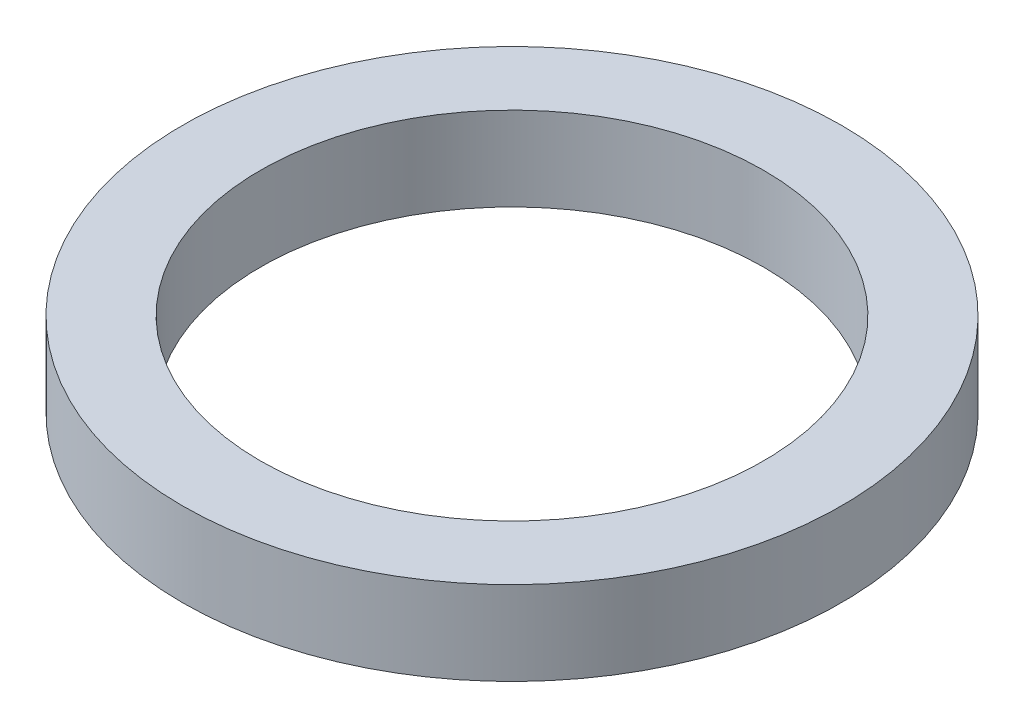
ISO-10303-21;
HEADER;
FILE_DESCRIPTION(('STEP AP214'),'2;1');
FILE_NAME('part.step','',(''),(''),'','','');
FILE_SCHEMA(('AUTOMOTIVE_DESIGN { 1 0 10303 214 1 1 1 1 }'));
ENDSEC;
DATA;
#1=APPLICATION_CONTEXT('core data for automotive mechanical design processes');
#2=APPLICATION_PROTOCOL_DEFINITION('international standard','automotive_design',2000,#1);
#3=PRODUCT_CONTEXT('',#1,'mechanical');
#4=PRODUCT('Part','Part','',(#3));
#5=PRODUCT_RELATED_PRODUCT_CATEGORY('part','',(#4));
#6=PRODUCT_DEFINITION_FORMATION('','',#4);
#7=PRODUCT_DEFINITION_CONTEXT('part definition',#1,'design');
#8=PRODUCT_DEFINITION('design','',#6,#7);
#9=PRODUCT_DEFINITION_SHAPE('','',#8);
#10=(LENGTH_UNIT() NAMED_UNIT(*) SI_UNIT(.MILLI.,.METRE.));
#11=(NAMED_UNIT(*) PLANE_ANGLE_UNIT() SI_UNIT($,.RADIAN.));
#12=(NAMED_UNIT(*) SI_UNIT($,.STERADIAN.) SOLID_ANGLE_UNIT());
#13=UNCERTAINTY_MEASURE_WITH_UNIT(LENGTH_MEASURE(1.E-05),#10,'distance_accuracy_value','');
#14=(GEOMETRIC_REPRESENTATION_CONTEXT(3) GLOBAL_UNCERTAINTY_ASSIGNED_CONTEXT((#13)) GLOBAL_UNIT_ASSIGNED_CONTEXT((#10,
#11,#12)) REPRESENTATION_CONTEXT('',''));
#15=CARTESIAN_POINT('',(0.,0.,0.));
#16=DIRECTION('',(0.,0.,1.));
#17=DIRECTION('',(1.,0.,0.));
#18=AXIS2_PLACEMENT_3D('',#15,#16,#17);
#19=CARTESIAN_POINT('',(0.,0.7,0.));
#20=DIRECTION('',(0.,1.,0.));
#21=DIRECTION('',(0.,0.,1.));
#22=AXIS2_PLACEMENT_3D('',#19,#20,#21);
#23=PLANE('',#22);
#24=CARTESIAN_POINT('',(0.,0.7,0.));
#25=DIRECTION('',(0.,1.,0.));
#26=DIRECTION('',(0.,0.,1.));
#27=AXIS2_PLACEMENT_3D('',#24,#25,#26);
#28=CIRCLE('',#27,2.75);
#29=CARTESIAN_POINT('',(0.,0.7,2.75));
#30=VERTEX_POINT('',#29);
#31=EDGE_CURVE('E10',#30,#30,#28,.T.);
#32=ORIENTED_EDGE('',*,*,#31,.T.);
#33=EDGE_LOOP('',(#32));
#34=FACE_BOUND('',#33,.T.);
#35=CARTESIAN_POINT('',(0.,0.7,0.));
#36=DIRECTION('',(0.,1.,0.));
#37=DIRECTION('',(0.,0.,1.));
#38=AXIS2_PLACEMENT_3D('',#35,#36,#37);
#39=CIRCLE('',#38,2.1);
#40=CARTESIAN_POINT('',(0.,0.7,2.1));
#41=VERTEX_POINT('',#40);
#42=EDGE_CURVE('E48',#41,#41,#39,.T.);
#43=ORIENTED_EDGE('',*,*,#42,.F.);
#44=EDGE_LOOP('',(#43));
#45=FACE_BOUND('',#44,.T.);
#46=ADVANCED_FACE('F37',(#34,#45),#23,.T.);
#47=CARTESIAN_POINT('',(0.,0.,0.));
#48=DIRECTION('',(0.,1.,0.));
#49=DIRECTION('',(0.,0.,1.));
#50=AXIS2_PLACEMENT_3D('',#47,#48,#49);
#51=PLANE('',#50);
#52=CARTESIAN_POINT('',(0.,0.,0.));
#53=DIRECTION('',(0.,1.,0.));
#54=DIRECTION('',(0.,0.,1.));
#55=AXIS2_PLACEMENT_3D('',#52,#53,#54);
#56=CIRCLE('',#55,2.75);
#57=CARTESIAN_POINT('',(0.,0.,2.75));
#58=VERTEX_POINT('',#57);
#59=EDGE_CURVE('E41',#58,#58,#56,.T.);
#60=ORIENTED_EDGE('',*,*,#59,.F.);
#61=EDGE_LOOP('',(#60));
#62=FACE_BOUND('',#61,.T.);
#63=CARTESIAN_POINT('',(0.,0.,0.));
#64=DIRECTION('',(0.,1.,0.));
#65=DIRECTION('',(0.,0.,1.));
#66=AXIS2_PLACEMENT_3D('',#63,#64,#65);
#67=CIRCLE('',#66,2.1);
#68=CARTESIAN_POINT('',(0.,0.,2.1));
#69=VERTEX_POINT('',#68);
#70=EDGE_CURVE('E50',#69,#69,#67,.T.);
#71=ORIENTED_EDGE('',*,*,#70,.T.);
#72=EDGE_LOOP('',(#71));
#73=FACE_BOUND('',#72,.T.);
#74=ADVANCED_FACE('F60',(#62,#73),#51,.F.);
#75=CARTESIAN_POINT('',(0.,0.7,0.));
#76=DIRECTION('',(0.,-1.,0.));
#77=DIRECTION('',(0.,0.,-1.));
#78=AXIS2_PLACEMENT_3D('',#75,#76,#77);
#79=CYLINDRICAL_SURFACE('',#78,2.75);
#80=ORIENTED_EDGE('',*,*,#31,.F.);
#81=EDGE_LOOP('',(#80));
#82=FACE_BOUND('',#81,.T.);
#83=ORIENTED_EDGE('',*,*,#59,.T.);
#84=EDGE_LOOP('',(#83));
#85=FACE_BOUND('',#84,.T.);
#86=ADVANCED_FACE('F39',(#82,#85),#79,.T.);
#87=CARTESIAN_POINT('',(0.,0.7,0.));
#88=DIRECTION('',(0.,-1.,0.));
#89=DIRECTION('',(0.,0.,-1.));
#90=AXIS2_PLACEMENT_3D('',#87,#88,#89);
#91=CYLINDRICAL_SURFACE('',#90,2.1);
#92=ORIENTED_EDGE('',*,*,#42,.T.);
#93=EDGE_LOOP('',(#92));
#94=FACE_BOUND('',#93,.T.);
#95=ORIENTED_EDGE('',*,*,#70,.F.);
#96=EDGE_LOOP('',(#95));
#97=FACE_BOUND('',#96,.T.);
#98=ADVANCED_FACE('F56',(#94,#97),#91,.F.);
#99=CLOSED_SHELL('',(#46,#74,#86,#98));
#100=MANIFOLD_SOLID_BREP('B2',#99);
#101=ADVANCED_BREP_SHAPE_REPRESENTATION('',(#18,#100),#14);
#102=SHAPE_DEFINITION_REPRESENTATION(#9,#101);
ENDSEC;
END-ISO-10303-21;
